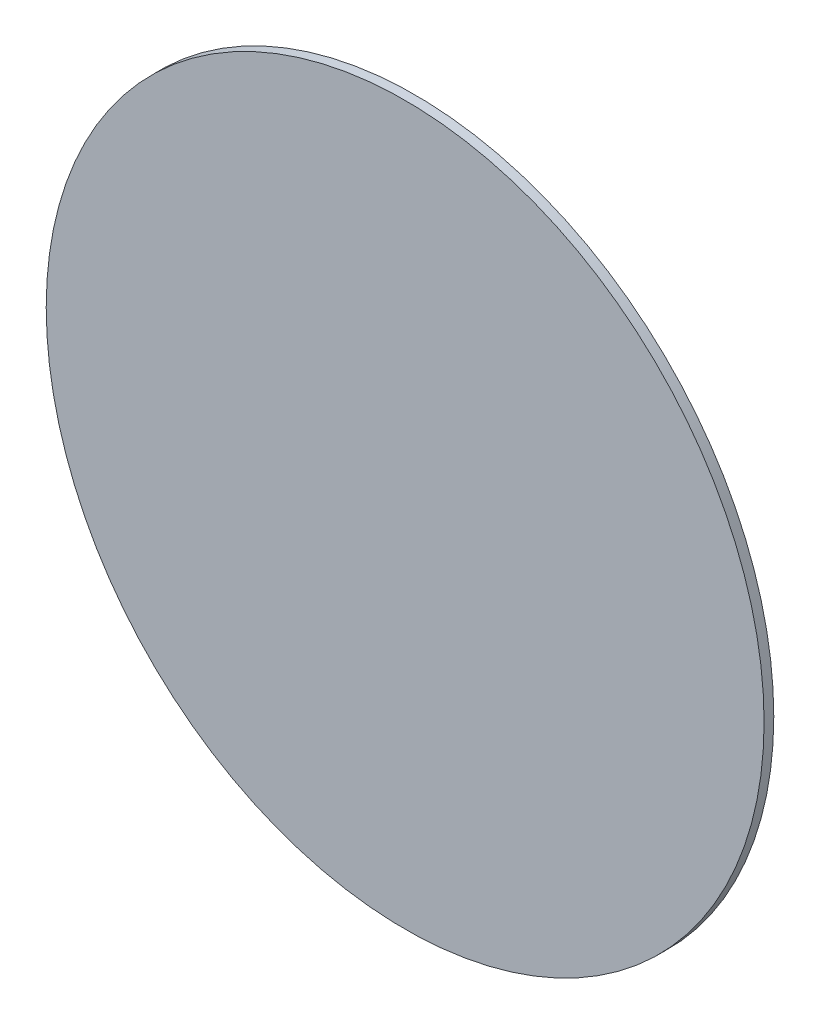
ISO-10303-21;
HEADER;
FILE_DESCRIPTION(('STEP AP214'),'2;1');
FILE_NAME('part.step','',(''),(''),'','','');
FILE_SCHEMA(('AUTOMOTIVE_DESIGN { 1 0 10303 214 1 1 1 1 }'));
ENDSEC;
DATA;
#1=APPLICATION_CONTEXT('core data for automotive mechanical design processes');
#2=APPLICATION_PROTOCOL_DEFINITION('international standard','automotive_design',2000,#1);
#3=PRODUCT_CONTEXT('',#1,'mechanical');
#4=PRODUCT('Part','Part','',(#3));
#5=PRODUCT_RELATED_PRODUCT_CATEGORY('part','',(#4));
#6=PRODUCT_DEFINITION_FORMATION('','',#4);
#7=PRODUCT_DEFINITION_CONTEXT('part definition',#1,'design');
#8=PRODUCT_DEFINITION('design','',#6,#7);
#9=PRODUCT_DEFINITION_SHAPE('','',#8);
#10=(LENGTH_UNIT() NAMED_UNIT(*) SI_UNIT(.MILLI.,.METRE.));
#11=(NAMED_UNIT(*) PLANE_ANGLE_UNIT() SI_UNIT($,.RADIAN.));
#12=(NAMED_UNIT(*) SI_UNIT($,.STERADIAN.) SOLID_ANGLE_UNIT());
#13=UNCERTAINTY_MEASURE_WITH_UNIT(LENGTH_MEASURE(1.E-05),#10,'distance_accuracy_value','');
#14=(GEOMETRIC_REPRESENTATION_CONTEXT(3) GLOBAL_UNCERTAINTY_ASSIGNED_CONTEXT((#13)) GLOBAL_UNIT_ASSIGNED_CONTEXT((#10,
#11,#12)) REPRESENTATION_CONTEXT('',''));
#15=CARTESIAN_POINT('',(0.,0.,0.));
#16=DIRECTION('',(0.,0.,1.));
#17=DIRECTION('',(1.,0.,0.));
#18=AXIS2_PLACEMENT_3D('',#15,#16,#17);
#19=CARTESIAN_POINT('',(0.,0.,1.));
#20=DIRECTION('',(0.,0.,-1.));
#21=DIRECTION('',(-1.,0.,0.));
#22=AXIS2_PLACEMENT_3D('',#19,#20,#21);
#23=CYLINDRICAL_SURFACE('',#22,37.);
#24=CARTESIAN_POINT('',(0.,0.,1.));
#25=DIRECTION('',(0.,0.,1.));
#26=DIRECTION('',(1.,0.,0.));
#27=AXIS2_PLACEMENT_3D('',#24,#25,#26);
#28=CIRCLE('',#27,37.);
#29=CARTESIAN_POINT('',(37.,0.,1.));
#30=VERTEX_POINT('',#29);
#31=EDGE_CURVE('E10',#30,#30,#28,.T.);
#32=ORIENTED_EDGE('',*,*,#31,.F.);
#33=EDGE_LOOP('',(#32));
#34=FACE_BOUND('',#33,.T.);
#35=CARTESIAN_POINT('',(0.,0.,0.));
#36=DIRECTION('',(0.,0.,1.));
#37=DIRECTION('',(1.,0.,0.));
#38=AXIS2_PLACEMENT_3D('',#35,#36,#37);
#39=CIRCLE('',#38,37.);
#40=CARTESIAN_POINT('',(37.,0.,0.));
#41=VERTEX_POINT('',#40);
#42=EDGE_CURVE('E40',#41,#41,#39,.T.);
#43=ORIENTED_EDGE('',*,*,#42,.T.);
#44=EDGE_LOOP('',(#43));
#45=FACE_BOUND('',#44,.T.);
#46=ADVANCED_FACE('F37',(#34,#45),#23,.T.);
#47=CARTESIAN_POINT('',(0.,0.,1.));
#48=DIRECTION('',(0.,0.,1.));
#49=DIRECTION('',(1.,0.,0.));
#50=AXIS2_PLACEMENT_3D('',#47,#48,#49);
#51=PLANE('',#50);
#52=ORIENTED_EDGE('',*,*,#31,.T.);
#53=EDGE_LOOP('',(#52));
#54=FACE_BOUND('',#53,.T.);
#55=ADVANCED_FACE('F54',(#54),#51,.T.);
#56=CARTESIAN_POINT('',(0.,0.,0.));
#57=DIRECTION('',(0.,0.,1.));
#58=DIRECTION('',(1.,0.,0.));
#59=AXIS2_PLACEMENT_3D('',#56,#57,#58);
#60=PLANE('',#59);
#61=ORIENTED_EDGE('',*,*,#42,.F.);
#62=EDGE_LOOP('',(#61));
#63=FACE_BOUND('',#62,.T.);
#64=ADVANCED_FACE('F52',(#63),#60,.F.);
#65=CLOSED_SHELL('',(#46,#55,#64));
#66=MANIFOLD_SOLID_BREP('B2',#65);
#67=ADVANCED_BREP_SHAPE_REPRESENTATION('',(#18,#66),#14);
#68=SHAPE_DEFINITION_REPRESENTATION(#9,#67);
ENDSEC;
END-ISO-10303-21;
